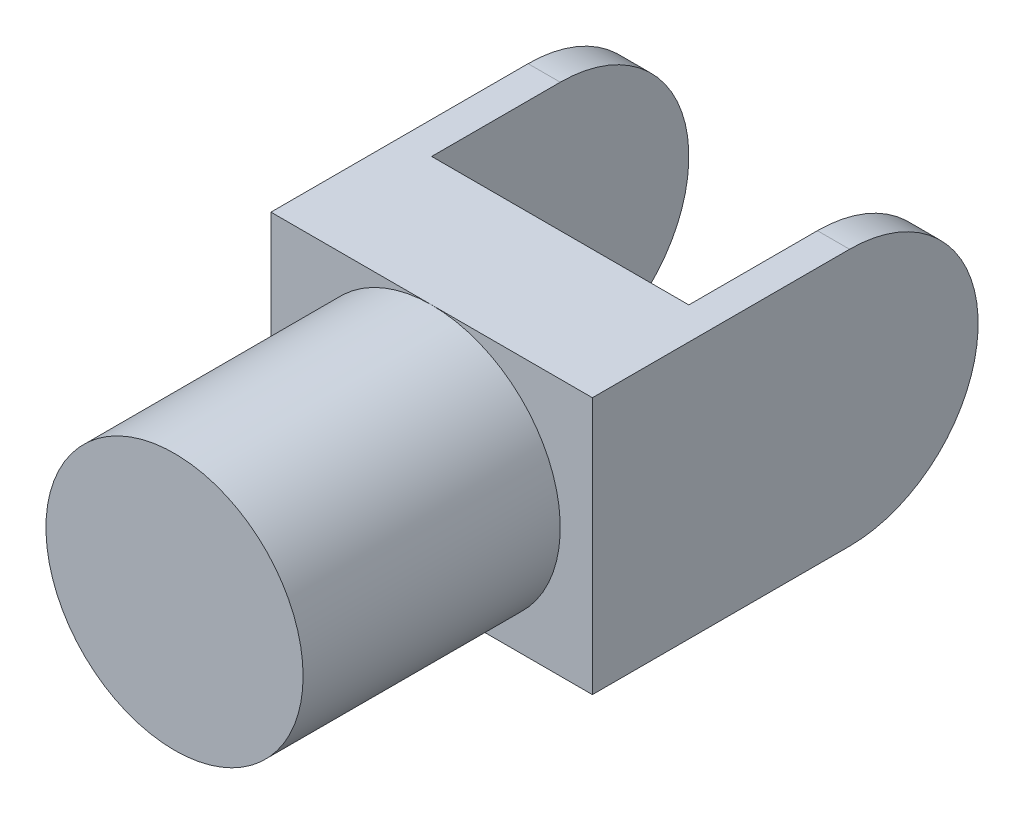
ISO-10303-21;
HEADER;
FILE_DESCRIPTION(('STEP AP214'),'2;1');
FILE_NAME('part.step','',(''),(''),'','','');
FILE_SCHEMA(('AUTOMOTIVE_DESIGN { 1 0 10303 214 1 1 1 1 }'));
ENDSEC;
DATA;
#1=APPLICATION_CONTEXT('core data for automotive mechanical design processes');
#2=APPLICATION_PROTOCOL_DEFINITION('international standard','automotive_design',2000,#1);
#3=PRODUCT_CONTEXT('',#1,'mechanical');
#4=PRODUCT('Part','Part','',(#3));
#5=PRODUCT_RELATED_PRODUCT_CATEGORY('part','',(#4));
#6=PRODUCT_DEFINITION_FORMATION('','',#4);
#7=PRODUCT_DEFINITION_CONTEXT('part definition',#1,'design');
#8=PRODUCT_DEFINITION('design','',#6,#7);
#9=PRODUCT_DEFINITION_SHAPE('','',#8);
#10=(LENGTH_UNIT() NAMED_UNIT(*) SI_UNIT(.MILLI.,.METRE.));
#11=(NAMED_UNIT(*) PLANE_ANGLE_UNIT() SI_UNIT($,.RADIAN.));
#12=(NAMED_UNIT(*) SI_UNIT($,.STERADIAN.) SOLID_ANGLE_UNIT());
#13=UNCERTAINTY_MEASURE_WITH_UNIT(LENGTH_MEASURE(1.E-05),#10,'distance_accuracy_value','');
#14=(GEOMETRIC_REPRESENTATION_CONTEXT(3) GLOBAL_UNCERTAINTY_ASSIGNED_CONTEXT((#13)) GLOBAL_UNIT_ASSIGNED_CONTEXT((#10,
#11,#12)) REPRESENTATION_CONTEXT('',''));
#15=CARTESIAN_POINT('',(0.,0.,0.));
#16=DIRECTION('',(0.,0.,1.));
#17=DIRECTION('',(1.,0.,0.));
#18=AXIS2_PLACEMENT_3D('',#15,#16,#17);
#19=CARTESIAN_POINT('',(100.,40.,80.));
#20=DIRECTION('',(0.,0.,-1.));
#21=DIRECTION('',(0.,1.,0.));
#22=AXIS2_PLACEMENT_3D('',#19,#20,#21);
#23=PLANE('',#22);
#24=CARTESIAN_POINT('',(50.,0.,80.));
#25=DIRECTION('',(0.,0.,1.));
#26=DIRECTION('',(1.,0.,0.));
#27=AXIS2_PLACEMENT_3D('',#24,#25,#26);
#28=CIRCLE('',#27,39.9999999999999);
#29=CARTESIAN_POINT('',(50.,39.9999999999999,80.));
#30=VERTEX_POINT('',#29);
#31=CARTESIAN_POINT('',(50.,-40.,80.));
#32=VERTEX_POINT('',#31);
#33=EDGE_CURVE('E47',#30,#32,#28,.T.);
#34=ORIENTED_EDGE('',*,*,#33,.F.);
#35=DIRECTION('',(-1.,0.,0.));
#36=VECTOR('',#35,1.);
#37=CARTESIAN_POINT('',(100.,40.,80.));
#38=LINE('',#37,#36);
#39=CARTESIAN_POINT('',(0.,40.,80.));
#40=VERTEX_POINT('',#39);
#41=EDGE_CURVE('E114',#30,#40,#38,.T.);
#42=ORIENTED_EDGE('',*,*,#41,.T.);
#43=DIRECTION('',(0.,-1.,0.));
#44=VECTOR('',#43,1.);
#45=CARTESIAN_POINT('',(0.,40.,80.));
#46=LINE('',#45,#44);
#47=CARTESIAN_POINT('',(0.,-40.,80.));
#48=VERTEX_POINT('',#47);
#49=EDGE_CURVE('E221',#40,#48,#46,.T.);
#50=ORIENTED_EDGE('',*,*,#49,.T.);
#51=DIRECTION('',(-1.,0.,0.));
#52=VECTOR('',#51,1.);
#53=CARTESIAN_POINT('',(100.,-40.,80.));
#54=LINE('',#53,#52);
#55=EDGE_CURVE('E127',#32,#48,#54,.T.);
#56=ORIENTED_EDGE('',*,*,#55,.F.);
#57=EDGE_LOOP('',(#34,#42,#50,#56));
#58=FACE_BOUND('',#57,.T.);
#59=ADVANCED_FACE('F37',(#58),#23,.F.);
#60=CARTESIAN_POINT('',(100.,0.,0.));
#61=DIRECTION('',(-1.,0.,0.));
#62=DIRECTION('',(0.,0.,1.));
#63=AXIS2_PLACEMENT_3D('',#60,#61,#62);
#64=CYLINDRICAL_SURFACE('',#63,40.);
#65=DIRECTION('',(-1.,0.,0.));
#66=VECTOR('',#65,1.);
#67=CARTESIAN_POINT('',(100.,40.,0.));
#68=LINE('',#67,#66);
#69=CARTESIAN_POINT('',(10.,40.,0.));
#70=VERTEX_POINT('',#69);
#71=CARTESIAN_POINT('',(0.,40.,0.));
#72=VERTEX_POINT('',#71);
#73=EDGE_CURVE('E113',#70,#72,#68,.T.);
#74=ORIENTED_EDGE('',*,*,#73,.F.);
#75=CARTESIAN_POINT('',(10.,0.,0.));
#76=DIRECTION('',(-1.,0.,0.));
#77=DIRECTION('',(0.,0.,1.));
#78=AXIS2_PLACEMENT_3D('',#75,#76,#77);
#79=CIRCLE('',#78,40.);
#80=CARTESIAN_POINT('',(10.,-40.,0.));
#81=VERTEX_POINT('',#80);
#82=EDGE_CURVE('E180',#70,#81,#79,.T.);
#83=ORIENTED_EDGE('',*,*,#82,.T.);
#84=DIRECTION('',(-1.,0.,0.));
#85=VECTOR('',#84,1.);
#86=CARTESIAN_POINT('',(100.,-40.,0.));
#87=LINE('',#86,#85);
#88=CARTESIAN_POINT('',(0.,-40.,0.));
#89=VERTEX_POINT('',#88);
#90=EDGE_CURVE('E199',#81,#89,#87,.T.);
#91=ORIENTED_EDGE('',*,*,#90,.T.);
#92=CARTESIAN_POINT('',(0.,0.,0.));
#93=DIRECTION('',(1.,0.,0.));
#94=DIRECTION('',(0.,0.,-1.));
#95=AXIS2_PLACEMENT_3D('',#92,#93,#94);
#96=CIRCLE('',#95,40.);
#97=EDGE_CURVE('E210',#89,#72,#96,.T.);
#98=ORIENTED_EDGE('',*,*,#97,.T.);
#99=EDGE_LOOP('',(#74,#83,#91,#98));
#100=FACE_BOUND('',#99,.T.);
#101=ADVANCED_FACE('F148',(#100),#64,.T.);
#102=CARTESIAN_POINT('',(90.,0.,0.));
#103=DIRECTION('',(1.,0.,0.));
#104=DIRECTION('',(0.,0.,-1.));
#105=AXIS2_PLACEMENT_3D('',#102,#103,#104);
#106=CIRCLE('',#105,40.);
#107=CARTESIAN_POINT('',(90.,-40.,0.));
#108=VERTEX_POINT('',#107);
#109=CARTESIAN_POINT('',(90.,40.,0.));
#110=VERTEX_POINT('',#109);
#111=EDGE_CURVE('E171',#108,#110,#106,.T.);
#112=ORIENTED_EDGE('',*,*,#111,.T.);
#113=CARTESIAN_POINT('',(100.,40.,0.));
#114=VERTEX_POINT('',#113);
#115=EDGE_CURVE('E175',#114,#110,#68,.T.);
#116=ORIENTED_EDGE('',*,*,#115,.F.);
#117=CARTESIAN_POINT('',(100.,0.,0.));
#118=DIRECTION('',(1.,0.,0.));
#119=DIRECTION('',(0.,0.,-1.));
#120=AXIS2_PLACEMENT_3D('',#117,#118,#119);
#121=CIRCLE('',#120,40.);
#122=CARTESIAN_POINT('',(100.,-40.,0.));
#123=VERTEX_POINT('',#122);
#124=EDGE_CURVE('E211',#123,#114,#121,.T.);
#125=ORIENTED_EDGE('',*,*,#124,.F.);
#126=EDGE_CURVE('E177',#123,#108,#87,.T.);
#127=ORIENTED_EDGE('',*,*,#126,.T.);
#128=EDGE_LOOP('',(#112,#116,#125,#127));
#129=FACE_BOUND('',#128,.T.);
#130=ADVANCED_FACE('F39',(#129),#64,.T.);
#131=CARTESIAN_POINT('',(100.,40.,0.));
#132=DIRECTION('',(0.,-1.,0.));
#133=DIRECTION('',(0.,0.,-1.));
#134=AXIS2_PLACEMENT_3D('',#131,#132,#133);
#135=PLANE('',#134);
#136=DIRECTION('',(1.,0.,0.));
#137=VECTOR('',#136,1.);
#138=CARTESIAN_POINT('',(10.,40.,40.));
#139=LINE('',#138,#137);
#140=CARTESIAN_POINT('',(10.,40.,40.));
#141=VERTEX_POINT('',#140);
#142=CARTESIAN_POINT('',(90.,40.,40.));
#143=VERTEX_POINT('',#142);
#144=EDGE_CURVE('E185',#141,#143,#139,.T.);
#145=ORIENTED_EDGE('',*,*,#144,.F.);
#146=DIRECTION('',(0.,0.,1.));
#147=VECTOR('',#146,1.);
#148=CARTESIAN_POINT('',(10.,40.,-40.));
#149=LINE('',#148,#147);
#150=EDGE_CURVE('E205',#70,#141,#149,.T.);
#151=ORIENTED_EDGE('',*,*,#150,.F.);
#152=ORIENTED_EDGE('',*,*,#73,.T.);
#153=DIRECTION('',(0.,0.,1.));
#154=VECTOR('',#153,1.);
#155=CARTESIAN_POINT('',(0.,40.,0.));
#156=LINE('',#155,#154);
#157=EDGE_CURVE('E121',#72,#40,#156,.T.);
#158=ORIENTED_EDGE('',*,*,#157,.T.);
#159=ORIENTED_EDGE('',*,*,#41,.F.);
#160=CARTESIAN_POINT('',(100.,40.,80.));
#161=VERTEX_POINT('',#160);
#162=EDGE_CURVE('E108',#161,#30,#38,.T.);
#163=ORIENTED_EDGE('',*,*,#162,.F.);
#164=DIRECTION('',(0.,0.,1.));
#165=VECTOR('',#164,1.);
#166=CARTESIAN_POINT('',(100.,40.,0.));
#167=LINE('',#166,#165);
#168=EDGE_CURVE('E187',#114,#161,#167,.T.);
#169=ORIENTED_EDGE('',*,*,#168,.F.);
#170=ORIENTED_EDGE('',*,*,#115,.T.);
#171=DIRECTION('',(0.,0.,-1.));
#172=VECTOR('',#171,1.);
#173=CARTESIAN_POINT('',(90.,40.,-40.));
#174=LINE('',#173,#172);
#175=EDGE_CURVE('E183',#143,#110,#174,.T.);
#176=ORIENTED_EDGE('',*,*,#175,.F.);
#177=EDGE_LOOP('',(#145,#151,#152,#158,#159,#163,#169,#170,#176));
#178=FACE_BOUND('',#177,.T.);
#179=ADVANCED_FACE('F119',(#178),#135,.F.);
#180=EDGE_CURVE('E11',#32,#30,#28,.T.);
#181=ORIENTED_EDGE('',*,*,#180,.F.);
#182=CARTESIAN_POINT('',(100.,-40.,80.));
#183=VERTEX_POINT('',#182);
#184=EDGE_CURVE('E125',#183,#32,#54,.T.);
#185=ORIENTED_EDGE('',*,*,#184,.F.);
#186=DIRECTION('',(0.,-1.,0.));
#187=VECTOR('',#186,1.);
#188=CARTESIAN_POINT('',(100.,40.,80.));
#189=LINE('',#188,#187);
#190=EDGE_CURVE('E111',#161,#183,#189,.T.);
#191=ORIENTED_EDGE('',*,*,#190,.F.);
#192=ORIENTED_EDGE('',*,*,#162,.T.);
#193=EDGE_LOOP('',(#181,#185,#191,#192));
#194=FACE_BOUND('',#193,.T.);
#195=ADVANCED_FACE('F110',(#194),#23,.F.);
#196=CARTESIAN_POINT('',(100.,-40.,80.));
#197=DIRECTION('',(0.,1.,0.));
#198=DIRECTION('',(0.,0.,1.));
#199=AXIS2_PLACEMENT_3D('',#196,#197,#198);
#200=PLANE('',#199);
#201=ORIENTED_EDGE('',*,*,#90,.F.);
#202=DIRECTION('',(0.,0.,1.));
#203=VECTOR('',#202,1.);
#204=CARTESIAN_POINT('',(10.,-40.,80.));
#205=LINE('',#204,#203);
#206=CARTESIAN_POINT('',(10.,-40.,40.));
#207=VERTEX_POINT('',#206);
#208=EDGE_CURVE('E41',#81,#207,#205,.T.);
#209=ORIENTED_EDGE('',*,*,#208,.T.);
#210=DIRECTION('',(1.,0.,0.));
#211=VECTOR('',#210,1.);
#212=CARTESIAN_POINT('',(100.,-40.,40.));
#213=LINE('',#212,#211);
#214=CARTESIAN_POINT('',(90.,-40.,40.));
#215=VERTEX_POINT('',#214);
#216=EDGE_CURVE('E189',#207,#215,#213,.T.);
#217=ORIENTED_EDGE('',*,*,#216,.T.);
#218=DIRECTION('',(0.,0.,-1.));
#219=VECTOR('',#218,1.);
#220=CARTESIAN_POINT('',(90.,-40.,80.));
#221=LINE('',#220,#219);
#222=EDGE_CURVE('E192',#215,#108,#221,.T.);
#223=ORIENTED_EDGE('',*,*,#222,.T.);
#224=ORIENTED_EDGE('',*,*,#126,.F.);
#225=DIRECTION('',(0.,0.,-1.));
#226=VECTOR('',#225,1.);
#227=CARTESIAN_POINT('',(100.,-40.,80.));
#228=LINE('',#227,#226);
#229=EDGE_CURVE('E216',#183,#123,#228,.T.);
#230=ORIENTED_EDGE('',*,*,#229,.F.);
#231=ORIENTED_EDGE('',*,*,#184,.T.);
#232=ORIENTED_EDGE('',*,*,#55,.T.);
#233=DIRECTION('',(0.,0.,-1.));
#234=VECTOR('',#233,1.);
#235=CARTESIAN_POINT('',(0.,-40.,80.));
#236=LINE('',#235,#234);
#237=EDGE_CURVE('E213',#48,#89,#236,.T.);
#238=ORIENTED_EDGE('',*,*,#237,.T.);
#239=EDGE_LOOP('',(#201,#209,#217,#223,#224,#230,#231,#232,#238));
#240=FACE_BOUND('',#239,.T.);
#241=ADVANCED_FACE('F156',(#240),#200,.F.);
#242=CARTESIAN_POINT('',(100.,0.,0.));
#243=DIRECTION('',(1.,0.,0.));
#244=DIRECTION('',(0.,0.,-1.));
#245=AXIS2_PLACEMENT_3D('',#242,#243,#244);
#246=PLANE('',#245);
#247=ORIENTED_EDGE('',*,*,#124,.T.);
#248=ORIENTED_EDGE('',*,*,#168,.T.);
#249=ORIENTED_EDGE('',*,*,#190,.T.);
#250=ORIENTED_EDGE('',*,*,#229,.T.);
#251=EDGE_LOOP('',(#247,#248,#249,#250));
#252=FACE_BOUND('',#251,.T.);
#253=ADVANCED_FACE('F161',(#252),#246,.T.);
#254=CARTESIAN_POINT('',(0.,0.,0.));
#255=DIRECTION('',(1.,0.,0.));
#256=DIRECTION('',(0.,0.,-1.));
#257=AXIS2_PLACEMENT_3D('',#254,#255,#256);
#258=PLANE('',#257);
#259=ORIENTED_EDGE('',*,*,#97,.F.);
#260=ORIENTED_EDGE('',*,*,#237,.F.);
#261=ORIENTED_EDGE('',*,*,#49,.F.);
#262=ORIENTED_EDGE('',*,*,#157,.F.);
#263=EDGE_LOOP('',(#259,#260,#261,#262));
#264=FACE_BOUND('',#263,.T.);
#265=ADVANCED_FACE('F228',(#264),#258,.F.);
#266=CARTESIAN_POINT('',(10.,-60.,-40.));
#267=DIRECTION('',(-1.,0.,0.));
#268=DIRECTION('',(0.,0.,1.));
#269=AXIS2_PLACEMENT_3D('',#266,#267,#268);
#270=PLANE('',#269);
#271=ORIENTED_EDGE('',*,*,#150,.T.);
#272=DIRECTION('',(0.,1.,0.));
#273=VECTOR('',#272,1.);
#274=CARTESIAN_POINT('',(10.,-60.,40.));
#275=LINE('',#274,#273);
#276=EDGE_CURVE('E184',#207,#141,#275,.T.);
#277=ORIENTED_EDGE('',*,*,#276,.F.);
#278=ORIENTED_EDGE('',*,*,#208,.F.);
#279=ORIENTED_EDGE('',*,*,#82,.F.);
#280=EDGE_LOOP('',(#271,#277,#278,#279));
#281=FACE_BOUND('',#280,.T.);
#282=ADVANCED_FACE('F202',(#281),#270,.F.);
#283=CARTESIAN_POINT('',(90.,-60.,-40.));
#284=DIRECTION('',(1.,0.,0.));
#285=DIRECTION('',(0.,0.,-1.));
#286=AXIS2_PLACEMENT_3D('',#283,#284,#285);
#287=PLANE('',#286);
#288=ORIENTED_EDGE('',*,*,#111,.F.);
#289=ORIENTED_EDGE('',*,*,#222,.F.);
#290=DIRECTION('',(0.,1.,0.));
#291=VECTOR('',#290,1.);
#292=CARTESIAN_POINT('',(90.,-60.,40.));
#293=LINE('',#292,#291);
#294=EDGE_CURVE('E60',#215,#143,#293,.T.);
#295=ORIENTED_EDGE('',*,*,#294,.T.);
#296=ORIENTED_EDGE('',*,*,#175,.T.);
#297=EDGE_LOOP('',(#288,#289,#295,#296));
#298=FACE_BOUND('',#297,.T.);
#299=ADVANCED_FACE('F143',(#298),#287,.F.);
#300=CARTESIAN_POINT('',(10.,-60.,40.));
#301=DIRECTION('',(0.,0.,1.));
#302=DIRECTION('',(0.,-1.,0.));
#303=AXIS2_PLACEMENT_3D('',#300,#301,#302);
#304=PLANE('',#303);
#305=ORIENTED_EDGE('',*,*,#276,.T.);
#306=ORIENTED_EDGE('',*,*,#144,.T.);
#307=ORIENTED_EDGE('',*,*,#294,.F.);
#308=ORIENTED_EDGE('',*,*,#216,.F.);
#309=EDGE_LOOP('',(#305,#306,#307,#308));
#310=FACE_BOUND('',#309,.T.);
#311=ADVANCED_FACE('F134',(#310),#304,.F.);
#312=CARTESIAN_POINT('',(50.,0.,160.));
#313=DIRECTION('',(0.,0.,-1.));
#314=DIRECTION('',(-1.,0.,0.));
#315=AXIS2_PLACEMENT_3D('',#312,#313,#314);
#316=CYLINDRICAL_SURFACE('',#315,39.9999999999999);
#317=CARTESIAN_POINT('',(50.,0.,160.));
#318=DIRECTION('',(0.,0.,1.));
#319=DIRECTION('',(1.,0.,0.));
#320=AXIS2_PLACEMENT_3D('',#317,#318,#319);
#321=CIRCLE('',#320,39.9999999999999);
#322=CARTESIAN_POINT('',(89.9999999999999,0.,160.));
#323=VERTEX_POINT('',#322);
#324=EDGE_CURVE('E130',#323,#323,#321,.T.);
#325=ORIENTED_EDGE('',*,*,#324,.F.);
#326=EDGE_LOOP('',(#325));
#327=FACE_BOUND('',#326,.T.);
#328=ORIENTED_EDGE('',*,*,#33,.T.);
#329=ORIENTED_EDGE('',*,*,#180,.T.);
#330=EDGE_LOOP('',(#328,#329));
#331=FACE_BOUND('',#330,.T.);
#332=ADVANCED_FACE('F131',(#327,#331),#316,.T.);
#333=CARTESIAN_POINT('',(50.,0.,160.));
#334=DIRECTION('',(0.,0.,1.));
#335=DIRECTION('',(1.,0.,0.));
#336=AXIS2_PLACEMENT_3D('',#333,#334,#335);
#337=PLANE('',#336);
#338=ORIENTED_EDGE('',*,*,#324,.T.);
#339=EDGE_LOOP('',(#338));
#340=FACE_BOUND('',#339,.T.);
#341=ADVANCED_FACE('F133',(#340),#337,.T.);
#342=CLOSED_SHELL('',(#59,#101,#130,#179,#195,#241,#253,#265,#282,#299,#311,#332,#341));
#343=MANIFOLD_SOLID_BREP('B2',#342);
#344=ADVANCED_BREP_SHAPE_REPRESENTATION('',(#18,#343),#14);
#345=SHAPE_DEFINITION_REPRESENTATION(#9,#344);
ENDSEC;
END-ISO-10303-21;
